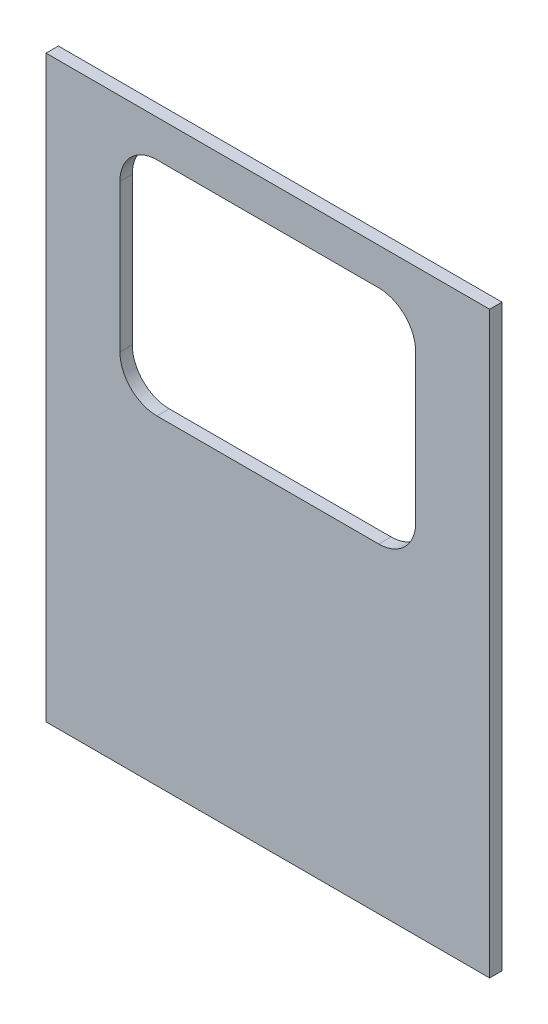
ISO-10303-21;
HEADER;
FILE_DESCRIPTION(('STEP AP214'),'2;1');
FILE_NAME('part.step','',(''),(''),'','','');
FILE_SCHEMA(('AUTOMOTIVE_DESIGN { 1 0 10303 214 1 1 1 1 }'));
ENDSEC;
DATA;
#1=APPLICATION_CONTEXT('core data for automotive mechanical design processes');
#2=APPLICATION_PROTOCOL_DEFINITION('international standard','automotive_design',2000,#1);
#3=PRODUCT_CONTEXT('',#1,'mechanical');
#4=PRODUCT('Part','Part','',(#3));
#5=PRODUCT_RELATED_PRODUCT_CATEGORY('part','',(#4));
#6=PRODUCT_DEFINITION_FORMATION('','',#4);
#7=PRODUCT_DEFINITION_CONTEXT('part definition',#1,'design');
#8=PRODUCT_DEFINITION('design','',#6,#7);
#9=PRODUCT_DEFINITION_SHAPE('','',#8);
#10=(LENGTH_UNIT() NAMED_UNIT(*) SI_UNIT(.MILLI.,.METRE.));
#11=(NAMED_UNIT(*) PLANE_ANGLE_UNIT() SI_UNIT($,.RADIAN.));
#12=(NAMED_UNIT(*) SI_UNIT($,.STERADIAN.) SOLID_ANGLE_UNIT());
#13=UNCERTAINTY_MEASURE_WITH_UNIT(LENGTH_MEASURE(1.E-05),#10,'distance_accuracy_value','');
#14=(GEOMETRIC_REPRESENTATION_CONTEXT(3) GLOBAL_UNCERTAINTY_ASSIGNED_CONTEXT((#13)) GLOBAL_UNIT_ASSIGNED_CONTEXT((#10,
#11,#12)) REPRESENTATION_CONTEXT('',''));
#15=CARTESIAN_POINT('',(0.,0.,0.));
#16=DIRECTION('',(0.,0.,1.));
#17=DIRECTION('',(1.,0.,0.));
#18=AXIS2_PLACEMENT_3D('',#15,#16,#17);
#19=CARTESIAN_POINT('',(0.,0.,25.4));
#20=DIRECTION('',(0.,0.,1.));
#21=DIRECTION('',(1.,0.,0.));
#22=AXIS2_PLACEMENT_3D('',#19,#20,#21);
#23=PLANE('',#22);
#24=DIRECTION('',(0.,1.,0.));
#25=VECTOR('',#24,1.);
#26=CARTESIAN_POINT('',(457.2,596.9,25.4));
#27=LINE('',#26,#25);
#28=CARTESIAN_POINT('',(457.2,-596.9,25.4));
#29=VERTEX_POINT('',#28);
#30=CARTESIAN_POINT('',(457.2,596.9,25.4));
#31=VERTEX_POINT('',#30);
#32=EDGE_CURVE('E138',#29,#31,#27,.T.);
#33=ORIENTED_EDGE('',*,*,#32,.T.);
#34=DIRECTION('',(-1.,0.,0.));
#35=VECTOR('',#34,1.);
#36=CARTESIAN_POINT('',(-457.2,596.9,25.4));
#37=LINE('',#36,#35);
#38=CARTESIAN_POINT('',(-457.2,596.9,25.4));
#39=VERTEX_POINT('',#38);
#40=EDGE_CURVE('E127',#31,#39,#37,.T.);
#41=ORIENTED_EDGE('',*,*,#40,.T.);
#42=DIRECTION('',(0.,-1.,0.));
#43=VECTOR('',#42,1.);
#44=CARTESIAN_POINT('',(-457.2,596.9,25.4));
#45=LINE('',#44,#43);
#46=CARTESIAN_POINT('',(-457.2,-596.9,25.4));
#47=VERTEX_POINT('',#46);
#48=EDGE_CURVE('E137',#39,#47,#45,.T.);
#49=ORIENTED_EDGE('',*,*,#48,.T.);
#50=DIRECTION('',(1.,0.,0.));
#51=VECTOR('',#50,1.);
#52=CARTESIAN_POINT('',(-457.2,-596.9,25.4));
#53=LINE('',#52,#51);
#54=EDGE_CURVE('E142',#47,#29,#53,.T.);
#55=ORIENTED_EDGE('',*,*,#54,.T.);
#56=EDGE_LOOP('',(#33,#41,#49,#55));
#57=FACE_BOUND('',#56,.T.);
#58=DIRECTION('',(-1.,0.,0.));
#59=VECTOR('',#58,1.);
#60=CARTESIAN_POINT('',(-304.8,520.7,25.4));
#61=LINE('',#60,#59);
#62=CARTESIAN_POINT('',(228.6,520.7,25.4));
#63=VERTEX_POINT('',#62);
#64=CARTESIAN_POINT('',(-228.6,520.7,25.4));
#65=VERTEX_POINT('',#64);
#66=EDGE_CURVE('E208',#63,#65,#61,.T.);
#67=ORIENTED_EDGE('',*,*,#66,.F.);
#68=CARTESIAN_POINT('',(228.6,444.5,25.4));
#69=DIRECTION('',(0.,0.,1.));
#70=DIRECTION('',(1.,0.,0.));
#71=AXIS2_PLACEMENT_3D('',#68,#69,#70);
#72=CIRCLE('',#71,76.2);
#73=CARTESIAN_POINT('',(304.8,444.5,25.4));
#74=VERTEX_POINT('',#73);
#75=EDGE_CURVE('E177',#63,#74,#72,.F.);
#76=ORIENTED_EDGE('',*,*,#75,.T.);
#77=DIRECTION('',(0.,1.,0.));
#78=VECTOR('',#77,1.);
#79=CARTESIAN_POINT('',(304.8,520.7,25.4));
#80=LINE('',#79,#78);
#81=CARTESIAN_POINT('',(304.8,139.7,25.4));
#82=VERTEX_POINT('',#81);
#83=EDGE_CURVE('E196',#82,#74,#80,.T.);
#84=ORIENTED_EDGE('',*,*,#83,.F.);
#85=CARTESIAN_POINT('',(228.6,139.7,25.4));
#86=DIRECTION('',(0.,0.,1.));
#87=DIRECTION('',(1.,0.,0.));
#88=AXIS2_PLACEMENT_3D('',#85,#86,#87);
#89=CIRCLE('',#88,76.2);
#90=CARTESIAN_POINT('',(228.6,63.4999999999999,25.4));
#91=VERTEX_POINT('',#90);
#92=EDGE_CURVE('E52',#82,#91,#89,.F.);
#93=ORIENTED_EDGE('',*,*,#92,.T.);
#94=DIRECTION('',(1.,0.,0.));
#95=VECTOR('',#94,1.);
#96=CARTESIAN_POINT('',(-304.8,63.4999999999999,25.4));
#97=LINE('',#96,#95);
#98=CARTESIAN_POINT('',(-228.6,63.4999999999999,25.4));
#99=VERTEX_POINT('',#98);
#100=EDGE_CURVE('E204',#99,#91,#97,.T.);
#101=ORIENTED_EDGE('',*,*,#100,.F.);
#102=CARTESIAN_POINT('',(-228.6,139.7,25.4));
#103=DIRECTION('',(0.,0.,1.));
#104=DIRECTION('',(1.,0.,0.));
#105=AXIS2_PLACEMENT_3D('',#102,#103,#104);
#106=CIRCLE('',#105,76.2);
#107=CARTESIAN_POINT('',(-304.8,139.7,25.4));
#108=VERTEX_POINT('',#107);
#109=EDGE_CURVE('E11',#99,#108,#106,.F.);
#110=ORIENTED_EDGE('',*,*,#109,.T.);
#111=DIRECTION('',(0.,-1.,0.));
#112=VECTOR('',#111,1.);
#113=CARTESIAN_POINT('',(-304.8,520.7,25.4));
#114=LINE('',#113,#112);
#115=CARTESIAN_POINT('',(-304.8,444.5,25.4));
#116=VERTEX_POINT('',#115);
#117=EDGE_CURVE('E202',#116,#108,#114,.T.);
#118=ORIENTED_EDGE('',*,*,#117,.F.);
#119=CARTESIAN_POINT('',(-228.6,444.5,25.4));
#120=DIRECTION('',(0.,0.,1.));
#121=DIRECTION('',(1.,0.,0.));
#122=AXIS2_PLACEMENT_3D('',#119,#120,#121);
#123=CIRCLE('',#122,76.2);
#124=EDGE_CURVE('E181',#116,#65,#123,.F.);
#125=ORIENTED_EDGE('',*,*,#124,.T.);
#126=EDGE_LOOP('',(#67,#76,#84,#93,#101,#110,#118,#125));
#127=FACE_BOUND('',#126,.T.);
#128=ADVANCED_FACE('F37',(#57,#127),#23,.T.);
#129=CARTESIAN_POINT('',(0.,0.,0.));
#130=DIRECTION('',(0.,0.,1.));
#131=DIRECTION('',(1.,0.,0.));
#132=AXIS2_PLACEMENT_3D('',#129,#130,#131);
#133=PLANE('',#132);
#134=DIRECTION('',(0.,1.,0.));
#135=VECTOR('',#134,1.);
#136=CARTESIAN_POINT('',(457.2,596.9,0.));
#137=LINE('',#136,#135);
#138=CARTESIAN_POINT('',(457.2,-596.9,0.));
#139=VERTEX_POINT('',#138);
#140=CARTESIAN_POINT('',(457.2,596.9,0.));
#141=VERTEX_POINT('',#140);
#142=EDGE_CURVE('E150',#139,#141,#137,.T.);
#143=ORIENTED_EDGE('',*,*,#142,.F.);
#144=DIRECTION('',(1.,0.,0.));
#145=VECTOR('',#144,1.);
#146=CARTESIAN_POINT('',(-457.2,-596.9,0.));
#147=LINE('',#146,#145);
#148=CARTESIAN_POINT('',(-457.2,-596.9,0.));
#149=VERTEX_POINT('',#148);
#150=EDGE_CURVE('E146',#149,#139,#147,.T.);
#151=ORIENTED_EDGE('',*,*,#150,.F.);
#152=DIRECTION('',(0.,-1.,0.));
#153=VECTOR('',#152,1.);
#154=CARTESIAN_POINT('',(-457.2,596.9,0.));
#155=LINE('',#154,#153);
#156=CARTESIAN_POINT('',(-457.2,596.9,0.));
#157=VERTEX_POINT('',#156);
#158=EDGE_CURVE('E228',#157,#149,#155,.T.);
#159=ORIENTED_EDGE('',*,*,#158,.F.);
#160=DIRECTION('',(-1.,0.,0.));
#161=VECTOR('',#160,1.);
#162=CARTESIAN_POINT('',(-457.2,596.9,0.));
#163=LINE('',#162,#161);
#164=EDGE_CURVE('E226',#141,#157,#163,.T.);
#165=ORIENTED_EDGE('',*,*,#164,.F.);
#166=EDGE_LOOP('',(#143,#151,#159,#165));
#167=FACE_BOUND('',#166,.T.);
#168=DIRECTION('',(1.,0.,0.));
#169=VECTOR('',#168,1.);
#170=CARTESIAN_POINT('',(-304.8,63.4999999999999,0.));
#171=LINE('',#170,#169);
#172=CARTESIAN_POINT('',(-228.6,63.4999999999999,0.));
#173=VERTEX_POINT('',#172);
#174=CARTESIAN_POINT('',(228.6,63.4999999999999,0.));
#175=VERTEX_POINT('',#174);
#176=EDGE_CURVE('E189',#173,#175,#171,.T.);
#177=ORIENTED_EDGE('',*,*,#176,.T.);
#178=CARTESIAN_POINT('',(228.6,139.7,0.));
#179=DIRECTION('',(0.,0.,1.));
#180=DIRECTION('',(1.,0.,0.));
#181=AXIS2_PLACEMENT_3D('',#178,#179,#180);
#182=CIRCLE('',#181,76.2);
#183=CARTESIAN_POINT('',(304.8,139.7,0.));
#184=VERTEX_POINT('',#183);
#185=EDGE_CURVE('E183',#175,#184,#182,.T.);
#186=ORIENTED_EDGE('',*,*,#185,.T.);
#187=DIRECTION('',(0.,1.,0.));
#188=VECTOR('',#187,1.);
#189=CARTESIAN_POINT('',(304.8,520.7,0.));
#190=LINE('',#189,#188);
#191=CARTESIAN_POINT('',(304.8,444.5,0.));
#192=VERTEX_POINT('',#191);
#193=EDGE_CURVE('E215',#184,#192,#190,.T.);
#194=ORIENTED_EDGE('',*,*,#193,.T.);
#195=CARTESIAN_POINT('',(228.6,444.5,0.));
#196=DIRECTION('',(0.,0.,1.));
#197=DIRECTION('',(1.,0.,0.));
#198=AXIS2_PLACEMENT_3D('',#195,#196,#197);
#199=CIRCLE('',#198,76.2);
#200=CARTESIAN_POINT('',(228.6,520.7,0.));
#201=VERTEX_POINT('',#200);
#202=EDGE_CURVE('E175',#192,#201,#199,.T.);
#203=ORIENTED_EDGE('',*,*,#202,.T.);
#204=DIRECTION('',(-1.,0.,0.));
#205=VECTOR('',#204,1.);
#206=CARTESIAN_POINT('',(-304.8,520.7,0.));
#207=LINE('',#206,#205);
#208=CARTESIAN_POINT('',(-228.6,520.7,0.));
#209=VERTEX_POINT('',#208);
#210=EDGE_CURVE('E218',#201,#209,#207,.T.);
#211=ORIENTED_EDGE('',*,*,#210,.T.);
#212=CARTESIAN_POINT('',(-228.6,444.5,0.));
#213=DIRECTION('',(0.,0.,1.));
#214=DIRECTION('',(1.,0.,0.));
#215=AXIS2_PLACEMENT_3D('',#212,#213,#214);
#216=CIRCLE('',#215,76.2);
#217=CARTESIAN_POINT('',(-304.8,444.5,0.));
#218=VERTEX_POINT('',#217);
#219=EDGE_CURVE('E179',#209,#218,#216,.T.);
#220=ORIENTED_EDGE('',*,*,#219,.T.);
#221=DIRECTION('',(0.,-1.,0.));
#222=VECTOR('',#221,1.);
#223=CARTESIAN_POINT('',(-304.8,520.7,0.));
#224=LINE('',#223,#222);
#225=CARTESIAN_POINT('',(-304.8,139.7,0.));
#226=VERTEX_POINT('',#225);
#227=EDGE_CURVE('E191',#218,#226,#224,.T.);
#228=ORIENTED_EDGE('',*,*,#227,.T.);
#229=CARTESIAN_POINT('',(-228.6,139.7,0.));
#230=DIRECTION('',(0.,0.,1.));
#231=DIRECTION('',(1.,0.,0.));
#232=AXIS2_PLACEMENT_3D('',#229,#230,#231);
#233=CIRCLE('',#232,76.2);
#234=EDGE_CURVE('E45',#226,#173,#233,.T.);
#235=ORIENTED_EDGE('',*,*,#234,.T.);
#236=EDGE_LOOP('',(#177,#186,#194,#203,#211,#220,#228,#235));
#237=FACE_BOUND('',#236,.T.);
#238=ADVANCED_FACE('F188',(#167,#237),#133,.F.);
#239=CARTESIAN_POINT('',(457.2,596.9,25.4));
#240=DIRECTION('',(-1.,0.,0.));
#241=DIRECTION('',(0.,-1.,0.));
#242=AXIS2_PLACEMENT_3D('',#239,#240,#241);
#243=PLANE('',#242);
#244=ORIENTED_EDGE('',*,*,#142,.T.);
#245=DIRECTION('',(0.,0.,-1.));
#246=VECTOR('',#245,1.);
#247=CARTESIAN_POINT('',(457.2,596.9,25.4));
#248=LINE('',#247,#246);
#249=EDGE_CURVE('E131',#31,#141,#248,.T.);
#250=ORIENTED_EDGE('',*,*,#249,.F.);
#251=ORIENTED_EDGE('',*,*,#32,.F.);
#252=DIRECTION('',(0.,0.,-1.));
#253=VECTOR('',#252,1.);
#254=CARTESIAN_POINT('',(457.2,-596.9,25.4));
#255=LINE('',#254,#253);
#256=EDGE_CURVE('E224',#29,#139,#255,.T.);
#257=ORIENTED_EDGE('',*,*,#256,.T.);
#258=EDGE_LOOP('',(#244,#250,#251,#257));
#259=FACE_BOUND('',#258,.T.);
#260=ADVANCED_FACE('F148',(#259),#243,.F.);
#261=CARTESIAN_POINT('',(-457.2,596.9,25.4));
#262=DIRECTION('',(0.,-1.,0.));
#263=DIRECTION('',(0.,0.,-1.));
#264=AXIS2_PLACEMENT_3D('',#261,#262,#263);
#265=PLANE('',#264);
#266=ORIENTED_EDGE('',*,*,#164,.T.);
#267=DIRECTION('',(0.,0.,-1.));
#268=VECTOR('',#267,1.);
#269=CARTESIAN_POINT('',(-457.2,596.9,25.4));
#270=LINE('',#269,#268);
#271=EDGE_CURVE('E134',#39,#157,#270,.T.);
#272=ORIENTED_EDGE('',*,*,#271,.F.);
#273=ORIENTED_EDGE('',*,*,#40,.F.);
#274=ORIENTED_EDGE('',*,*,#249,.T.);
#275=EDGE_LOOP('',(#266,#272,#273,#274));
#276=FACE_BOUND('',#275,.T.);
#277=ADVANCED_FACE('F129',(#276),#265,.F.);
#278=CARTESIAN_POINT('',(-457.2,596.9,25.4));
#279=DIRECTION('',(1.,0.,0.));
#280=DIRECTION('',(0.,1.,0.));
#281=AXIS2_PLACEMENT_3D('',#278,#279,#280);
#282=PLANE('',#281);
#283=ORIENTED_EDGE('',*,*,#158,.T.);
#284=DIRECTION('',(0.,0.,-1.));
#285=VECTOR('',#284,1.);
#286=CARTESIAN_POINT('',(-457.2,-596.9,25.4));
#287=LINE('',#286,#285);
#288=EDGE_CURVE('E155',#47,#149,#287,.T.);
#289=ORIENTED_EDGE('',*,*,#288,.F.);
#290=ORIENTED_EDGE('',*,*,#48,.F.);
#291=ORIENTED_EDGE('',*,*,#271,.T.);
#292=EDGE_LOOP('',(#283,#289,#290,#291));
#293=FACE_BOUND('',#292,.T.);
#294=ADVANCED_FACE('F239',(#293),#282,.F.);
#295=CARTESIAN_POINT('',(-457.2,-596.9,25.4));
#296=DIRECTION('',(0.,1.,0.));
#297=DIRECTION('',(-1.,0.,0.));
#298=AXIS2_PLACEMENT_3D('',#295,#296,#297);
#299=PLANE('',#298);
#300=ORIENTED_EDGE('',*,*,#150,.T.);
#301=ORIENTED_EDGE('',*,*,#256,.F.);
#302=ORIENTED_EDGE('',*,*,#54,.F.);
#303=ORIENTED_EDGE('',*,*,#288,.T.);
#304=EDGE_LOOP('',(#300,#301,#302,#303));
#305=FACE_BOUND('',#304,.T.);
#306=ADVANCED_FACE('F235',(#305),#299,.F.);
#307=CARTESIAN_POINT('',(304.8,520.7,25.4));
#308=DIRECTION('',(-1.,0.,0.));
#309=DIRECTION('',(0.,-1.,0.));
#310=AXIS2_PLACEMENT_3D('',#307,#308,#309);
#311=PLANE('',#310);
#312=ORIENTED_EDGE('',*,*,#83,.T.);
#313=DIRECTION('',(0.,0.,-1.));
#314=VECTOR('',#313,1.);
#315=CARTESIAN_POINT('',(304.8,444.5,0.));
#316=LINE('',#315,#314);
#317=EDGE_CURVE('E153',#74,#192,#316,.T.);
#318=ORIENTED_EDGE('',*,*,#317,.T.);
#319=ORIENTED_EDGE('',*,*,#193,.F.);
#320=DIRECTION('',(0.,0.,-1.));
#321=VECTOR('',#320,1.);
#322=CARTESIAN_POINT('',(304.8,139.7,25.4));
#323=LINE('',#322,#321);
#324=EDGE_CURVE('E151',#184,#82,#323,.F.);
#325=ORIENTED_EDGE('',*,*,#324,.T.);
#326=EDGE_LOOP('',(#312,#318,#319,#325));
#327=FACE_BOUND('',#326,.T.);
#328=ADVANCED_FACE('F246',(#327),#311,.T.);
#329=CARTESIAN_POINT('',(-304.8,520.7,25.4));
#330=DIRECTION('',(0.,-1.,0.));
#331=DIRECTION('',(0.,0.,-1.));
#332=AXIS2_PLACEMENT_3D('',#329,#330,#331);
#333=PLANE('',#332);
#334=ORIENTED_EDGE('',*,*,#210,.F.);
#335=DIRECTION('',(0.,0.,-1.));
#336=VECTOR('',#335,1.);
#337=CARTESIAN_POINT('',(228.6,520.7,25.4));
#338=LINE('',#337,#336);
#339=EDGE_CURVE('E164',#201,#63,#338,.F.);
#340=ORIENTED_EDGE('',*,*,#339,.T.);
#341=ORIENTED_EDGE('',*,*,#66,.T.);
#342=DIRECTION('',(0.,0.,-1.));
#343=VECTOR('',#342,1.);
#344=CARTESIAN_POINT('',(-228.6,520.7,0.));
#345=LINE('',#344,#343);
#346=EDGE_CURVE('E161',#65,#209,#345,.T.);
#347=ORIENTED_EDGE('',*,*,#346,.T.);
#348=EDGE_LOOP('',(#334,#340,#341,#347));
#349=FACE_BOUND('',#348,.T.);
#350=ADVANCED_FACE('F258',(#349),#333,.T.);
#351=CARTESIAN_POINT('',(-304.8,520.7,25.4));
#352=DIRECTION('',(1.,0.,0.));
#353=DIRECTION('',(0.,1.,0.));
#354=AXIS2_PLACEMENT_3D('',#351,#352,#353);
#355=PLANE('',#354);
#356=ORIENTED_EDGE('',*,*,#227,.F.);
#357=DIRECTION('',(0.,0.,-1.));
#358=VECTOR('',#357,1.);
#359=CARTESIAN_POINT('',(-304.8,444.5,25.4));
#360=LINE('',#359,#358);
#361=EDGE_CURVE('E169',#218,#116,#360,.F.);
#362=ORIENTED_EDGE('',*,*,#361,.T.);
#363=ORIENTED_EDGE('',*,*,#117,.T.);
#364=DIRECTION('',(0.,0.,-1.));
#365=VECTOR('',#364,1.);
#366=CARTESIAN_POINT('',(-304.8,139.7,0.));
#367=LINE('',#366,#365);
#368=EDGE_CURVE('E166',#108,#226,#367,.T.);
#369=ORIENTED_EDGE('',*,*,#368,.T.);
#370=EDGE_LOOP('',(#356,#362,#363,#369));
#371=FACE_BOUND('',#370,.T.);
#372=ADVANCED_FACE('F206',(#371),#355,.T.);
#373=CARTESIAN_POINT('',(-304.8,63.4999999999999,25.4));
#374=DIRECTION('',(0.,1.,0.));
#375=DIRECTION('',(0.,0.,1.));
#376=AXIS2_PLACEMENT_3D('',#373,#374,#375);
#377=PLANE('',#376);
#378=ORIENTED_EDGE('',*,*,#100,.T.);
#379=DIRECTION('',(0.,0.,-1.));
#380=VECTOR('',#379,1.);
#381=CARTESIAN_POINT('',(228.6,63.4999999999999,0.));
#382=LINE('',#381,#380);
#383=EDGE_CURVE('E172',#91,#175,#382,.T.);
#384=ORIENTED_EDGE('',*,*,#383,.T.);
#385=ORIENTED_EDGE('',*,*,#176,.F.);
#386=DIRECTION('',(0.,0.,-1.));
#387=VECTOR('',#386,1.);
#388=CARTESIAN_POINT('',(-228.6,63.4999999999999,25.4));
#389=LINE('',#388,#387);
#390=EDGE_CURVE('E59',#173,#99,#389,.F.);
#391=ORIENTED_EDGE('',*,*,#390,.T.);
#392=EDGE_LOOP('',(#378,#384,#385,#391));
#393=FACE_BOUND('',#392,.T.);
#394=ADVANCED_FACE('F194',(#393),#377,.T.);
#395=CARTESIAN_POINT('',(228.6,444.5,25.4));
#396=DIRECTION('',(0.,0.,1.));
#397=DIRECTION('',(1.,0.,0.));
#398=AXIS2_PLACEMENT_3D('',#395,#396,#397);
#399=CYLINDRICAL_SURFACE('',#398,76.2);
#400=ORIENTED_EDGE('',*,*,#75,.F.);
#401=ORIENTED_EDGE('',*,*,#339,.F.);
#402=ORIENTED_EDGE('',*,*,#202,.F.);
#403=ORIENTED_EDGE('',*,*,#317,.F.);
#404=EDGE_LOOP('',(#400,#401,#402,#403));
#405=FACE_BOUND('',#404,.T.);
#406=ADVANCED_FACE('F266',(#405),#399,.F.);
#407=CARTESIAN_POINT('',(-228.6,444.5,25.4));
#408=DIRECTION('',(0.,0.,1.));
#409=DIRECTION('',(1.,0.,0.));
#410=AXIS2_PLACEMENT_3D('',#407,#408,#409);
#411=CYLINDRICAL_SURFACE('',#410,76.2);
#412=ORIENTED_EDGE('',*,*,#124,.F.);
#413=ORIENTED_EDGE('',*,*,#361,.F.);
#414=ORIENTED_EDGE('',*,*,#219,.F.);
#415=ORIENTED_EDGE('',*,*,#346,.F.);
#416=EDGE_LOOP('',(#412,#413,#414,#415));
#417=FACE_BOUND('',#416,.T.);
#418=ADVANCED_FACE('F270',(#417),#411,.F.);
#419=CARTESIAN_POINT('',(228.6,139.7,25.4));
#420=DIRECTION('',(0.,0.,1.));
#421=DIRECTION('',(1.,0.,0.));
#422=AXIS2_PLACEMENT_3D('',#419,#420,#421);
#423=CYLINDRICAL_SURFACE('',#422,76.2);
#424=ORIENTED_EDGE('',*,*,#92,.F.);
#425=ORIENTED_EDGE('',*,*,#324,.F.);
#426=ORIENTED_EDGE('',*,*,#185,.F.);
#427=ORIENTED_EDGE('',*,*,#383,.F.);
#428=EDGE_LOOP('',(#424,#425,#426,#427));
#429=FACE_BOUND('',#428,.T.);
#430=ADVANCED_FACE('F276',(#429),#423,.F.);
#431=CARTESIAN_POINT('',(-228.6,139.7,25.4));
#432=DIRECTION('',(0.,0.,1.));
#433=DIRECTION('',(1.,0.,0.));
#434=AXIS2_PLACEMENT_3D('',#431,#432,#433);
#435=CYLINDRICAL_SURFACE('',#434,76.2);
#436=ORIENTED_EDGE('',*,*,#109,.F.);
#437=ORIENTED_EDGE('',*,*,#390,.F.);
#438=ORIENTED_EDGE('',*,*,#234,.F.);
#439=ORIENTED_EDGE('',*,*,#368,.F.);
#440=EDGE_LOOP('',(#436,#437,#438,#439));
#441=FACE_BOUND('',#440,.T.);
#442=ADVANCED_FACE('F39',(#441),#435,.F.);
#443=CLOSED_SHELL('',(#128,#238,#260,#277,#294,#306,#328,#350,#372,#394,#406,#418,#430,#442));
#444=MANIFOLD_SOLID_BREP('B2',#443);
#445=ADVANCED_BREP_SHAPE_REPRESENTATION('',(#18,#444),#14);
#446=SHAPE_DEFINITION_REPRESENTATION(#9,#445);
ENDSEC;
END-ISO-10303-21;
